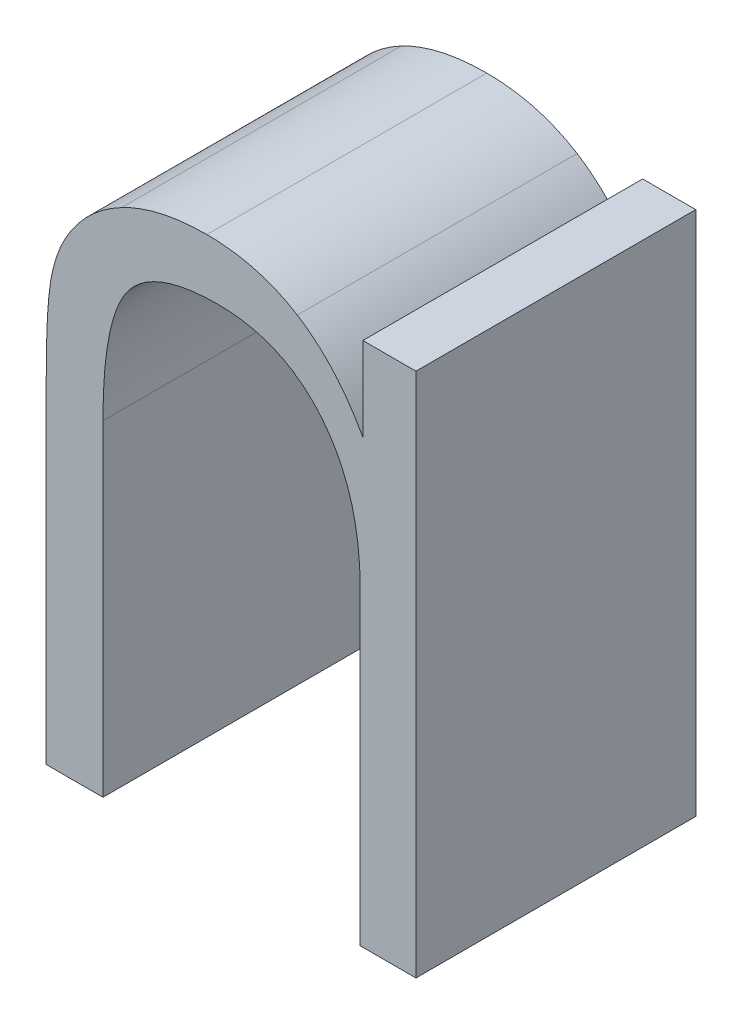
ISO-10303-21;
HEADER;
FILE_DESCRIPTION(('STEP AP214'),'2;1');
FILE_NAME('part.step','',(''),(''),'','','');
FILE_SCHEMA(('AUTOMOTIVE_DESIGN { 1 0 10303 214 1 1 1 1 }'));
ENDSEC;
DATA;
#1=APPLICATION_CONTEXT('core data for automotive mechanical design processes');
#2=APPLICATION_PROTOCOL_DEFINITION('international standard','automotive_design',2000,#1);
#3=PRODUCT_CONTEXT('',#1,'mechanical');
#4=PRODUCT('Part','Part','',(#3));
#5=PRODUCT_RELATED_PRODUCT_CATEGORY('part','',(#4));
#6=PRODUCT_DEFINITION_FORMATION('','',#4);
#7=PRODUCT_DEFINITION_CONTEXT('part definition',#1,'design');
#8=PRODUCT_DEFINITION('design','',#6,#7);
#9=PRODUCT_DEFINITION_SHAPE('','',#8);
#10=(LENGTH_UNIT() NAMED_UNIT(*) SI_UNIT(.MILLI.,.METRE.));
#11=(NAMED_UNIT(*) PLANE_ANGLE_UNIT() SI_UNIT($,.RADIAN.));
#12=(NAMED_UNIT(*) SI_UNIT($,.STERADIAN.) SOLID_ANGLE_UNIT());
#13=UNCERTAINTY_MEASURE_WITH_UNIT(LENGTH_MEASURE(1.E-05),#10,'distance_accuracy_value','');
#14=(GEOMETRIC_REPRESENTATION_CONTEXT(3) GLOBAL_UNCERTAINTY_ASSIGNED_CONTEXT((#13)) GLOBAL_UNIT_ASSIGNED_CONTEXT((#10,
#11,#12)) REPRESENTATION_CONTEXT('',''));
#15=CARTESIAN_POINT('',(0.,0.,0.));
#16=DIRECTION('',(0.,0.,1.));
#17=DIRECTION('',(1.,0.,0.));
#18=AXIS2_PLACEMENT_3D('',#15,#16,#17);
#19=CARTESIAN_POINT('',(-9.736482957406,-5.07579139178174,-5.5));
#20=DIRECTION('',(0.,0.,1.));
#21=DIRECTION('',(0.,-1.,0.));
#22=AXIS2_PLACEMENT_3D('',#19,#20,#21);
#23=PLANE('',#22);
#24=DIRECTION('',(0.,1.,0.));
#25=VECTOR('',#24,1.);
#26=CARTESIAN_POINT('',(-9.105806313635,-6.13847583919,-5.5));
#27=LINE('',#26,#25);
#28=CARTESIAN_POINT('',(-9.105806313635,-6.13847583919,-5.5));
#29=VERTEX_POINT('',#28);
#30=CARTESIAN_POINT('',(-9.105806313635,-4.260241794746,-5.5));
#31=VERTEX_POINT('',#30);
#32=EDGE_CURVE('E228',#29,#31,#27,.T.);
#33=ORIENTED_EDGE('',*,*,#32,.T.);
#34=DIRECTION('',(-1.,0.,0.));
#35=VECTOR('',#34,1.);
#36=CARTESIAN_POINT('',(-9.105806313635,-4.260241794746,-5.5));
#37=LINE('',#36,#35);
#38=CARTESIAN_POINT('',(-9.295623335857,-4.260241794746,-5.5));
#39=VERTEX_POINT('',#38);
#40=EDGE_CURVE('E223',#31,#39,#37,.T.);
#41=ORIENTED_EDGE('',*,*,#40,.T.);
#42=DIRECTION('',(0.,-1.,0.));
#43=VECTOR('',#42,1.);
#44=CARTESIAN_POINT('',(-9.295623335857,-4.260241794746,-5.5));
#45=LINE('',#44,#43);
#46=CARTESIAN_POINT('',(-9.295623335857,-4.559501772523,-5.5));
#47=VERTEX_POINT('',#46);
#48=EDGE_CURVE('E263',#39,#47,#45,.T.);
#49=ORIENTED_EDGE('',*,*,#48,.T.);
#50=CARTESIAN_POINT('',(-9.295623335857,-4.559501772523,-5.5));
#51=CARTESIAN_POINT('',(-9.35898786919,-4.443968461412,-5.5));
#52=CARTESIAN_POINT('',(-9.436929180301,-4.356990394746,-5.5));
#53=CARTESIAN_POINT('',(-9.529856491412,-4.298700216968,-5.5));
#54=(BOUNDED_CURVE() B_SPLINE_CURVE(3,(#50,#51,#52,#53),.UNSPECIFIED.,.F.,
.F.) B_SPLINE_CURVE_WITH_KNOTS((4,4),(0.,1.),
.UNSPECIFIED.) CURVE() GEOMETRIC_REPRESENTATION_ITEM() RATIONAL_B_SPLINE_CURVE((1.,1.,1.,1.)) REPRESENTATION_ITEM(''));
#55=CARTESIAN_POINT('',(-9.529856491412,-4.298700216968,-5.5));
#56=VERTEX_POINT('',#55);
#57=EDGE_CURVE('E291',#47,#56,#54,.T.);
#58=ORIENTED_EDGE('',*,*,#57,.T.);
#59=CARTESIAN_POINT('',(-22.8474219694646,-30.2296003791704,-5.5));
#60=DIRECTION('',(0.,0.,1.));
#61=DIRECTION('',(0.455370570291636,0.890301995792591,0.));
#62=AXIS2_PLACEMENT_3D('',#59,#60,#61);
#63=ELLIPSE('',#62,29.1529102385653,3.99176430542599);
#64=CARTESIAN_POINT('',(-9.852766691412,-4.211132305857,-5.5));
#65=VERTEX_POINT('',#64);
#66=EDGE_CURVE('E244',#56,#65,#63,.T.);
#67=ORIENTED_EDGE('',*,*,#66,.T.);
#68=CARTESIAN_POINT('',(-9.852766691412,-4.211132305857,-5.5));
#69=CARTESIAN_POINT('',(-9.968887024746,-4.211132305857,-5.5));
#70=CARTESIAN_POINT('',(-10.07069586919,-4.234051572523,-5.5));
#71=CARTESIAN_POINT('',(-10.15817346919,-4.280070728079,-5.5));
#72=(BOUNDED_CURVE() B_SPLINE_CURVE(3,(#68,#69,#70,#71),.UNSPECIFIED.,.F.,
.F.) B_SPLINE_CURVE_WITH_KNOTS((4,4),(0.,1.),
.UNSPECIFIED.) CURVE() GEOMETRIC_REPRESENTATION_ITEM() RATIONAL_B_SPLINE_CURVE((1.,1.,1.,1.)) REPRESENTATION_ITEM(''));
#73=CARTESIAN_POINT('',(-10.15817346919,-4.280070728079,-5.5));
#74=VERTEX_POINT('',#73);
#75=EDGE_CURVE('E354',#65,#74,#72,.T.);
#76=ORIENTED_EDGE('',*,*,#75,.T.);
#77=CARTESIAN_POINT('',(104.216214437207,-108.342170691661,-5.5));
#78=DIRECTION('',(0.,0.,1.));
#79=DIRECTION('',(-0.740395912074148,0.672171029860623,0.));
#80=AXIS2_PLACEMENT_3D('',#77,#78,#79);
#81=ELLIPSE('',#80,154.660357930457,8.45990369452761);
#82=CARTESIAN_POINT('',(-10.359135446968,-4.476370394746,-5.5));
#83=VERTEX_POINT('',#82);
#84=EDGE_CURVE('E271',#74,#83,#81,.T.);
#85=ORIENTED_EDGE('',*,*,#84,.T.);
#86=CARTESIAN_POINT('',(-8.24635407089343,-7.5648203471131,-5.5));
#87=DIRECTION('',(0.,0.,1.));
#88=DIRECTION('',(-0.535317252705023,0.844651075270935,0.));
#89=AXIS2_PLACEMENT_3D('',#86,#87,#88);
#90=ELLIPSE('',#89,3.7751112582971,0.96020332293076);
#91=CARTESIAN_POINT('',(-10.411355024746,-4.634499505857,-5.5));
#92=VERTEX_POINT('',#91);
#93=EDGE_CURVE('E382',#83,#92,#90,.T.);
#94=ORIENTED_EDGE('',*,*,#93,.T.);
#95=CARTESIAN_POINT('',(-8.59642921922141,-18.5490954288722,-5.5));
#96=DIRECTION('',(0.,0.,1.));
#97=DIRECTION('',(-0.126455778520576,0.991972245619178,0.));
#98=AXIS2_PLACEMENT_3D('',#95,#96,#97);
#99=ELLIPSE('',#98,14.0994026021358,0.418747631536533);
#100=CARTESIAN_POINT('',(-10.427128424746,-4.93968332807888,-5.5));
#101=VERTEX_POINT('',#100);
#102=EDGE_CURVE('E281',#92,#101,#99,.T.);
#103=ORIENTED_EDGE('',*,*,#102,.T.);
#104=DIRECTION('',(0.,-1.,0.));
#105=VECTOR('',#104,1.);
#106=CARTESIAN_POINT('',(-10.427128424746,-4.99425946141222,-5.5));
#107=LINE('',#106,#105);
#108=CARTESIAN_POINT('',(-10.427128424746,-6.138478661412,-5.5));
#109=VERTEX_POINT('',#108);
#110=EDGE_CURVE('E276',#101,#109,#107,.T.);
#111=ORIENTED_EDGE('',*,*,#110,.T.);
#112=DIRECTION('',(1.,0.,0.));
#113=VECTOR('',#112,1.);
#114=CARTESIAN_POINT('',(-10.427128424746,-6.138478661412,-5.5));
#115=LINE('',#114,#113);
#116=CARTESIAN_POINT('',(-10.224459002523,-6.138478661412,-5.5));
#117=VERTEX_POINT('',#116);
#118=EDGE_CURVE('E205',#109,#117,#115,.T.);
#119=ORIENTED_EDGE('',*,*,#118,.T.);
#120=DIRECTION('',(0.,1.,0.));
#121=VECTOR('',#120,1.);
#122=CARTESIAN_POINT('',(-10.224459002523,-6.138478661412,-5.5));
#123=LINE('',#122,#121);
#124=CARTESIAN_POINT('',(-10.224459002523,-4.9731125503011,-5.5));
#125=VERTEX_POINT('',#124);
#126=EDGE_CURVE('E201',#117,#125,#123,.T.);
#127=ORIENTED_EDGE('',*,*,#126,.T.);
#128=CARTESIAN_POINT('',(-10.224459002523,-4.9731125503011,-5.5));
#129=CARTESIAN_POINT('',(-10.224459002523,-4.752696994746,-5.5));
#130=CARTESIAN_POINT('',(-10.194227358079,-4.603144616968,-5.5));
#131=CARTESIAN_POINT('',(-10.133529824746,-4.52489003919,-5.5));
#132=(BOUNDED_CURVE() B_SPLINE_CURVE(3,(#128,#129,#130,#131),.UNSPECIFIED.,.F.,
.F.) B_SPLINE_CURVE_WITH_KNOTS((4,4),(0.,1.),
.UNSPECIFIED.) CURVE() GEOMETRIC_REPRESENTATION_ITEM() RATIONAL_B_SPLINE_CURVE((1.,1.,1.,1.)) REPRESENTATION_ITEM(''));
#133=CARTESIAN_POINT('',(-10.133529824746,-4.52489003919,-5.5));
#134=VERTEX_POINT('',#133);
#135=EDGE_CURVE('E186',#125,#134,#132,.T.);
#136=ORIENTED_EDGE('',*,*,#135,.T.);
#137=CARTESIAN_POINT('',(21.8561241505114,-31.5914710081315,-5.5));
#138=DIRECTION('',(0.,0.,-1.));
#139=DIRECTION('',(-0.763237745324347,0.646117747869695,0.));
#140=AXIS2_PLACEMENT_3D('',#137,#138,#139);
#141=ELLIPSE('',#140,41.9041521371283,3.18884140606767);
#142=CARTESIAN_POINT('',(-9.813794624746,-4.407282394746,-5.5));
#143=VERTEX_POINT('',#142);
#144=EDGE_CURVE('E252',#134,#143,#141,.T.);
#145=ORIENTED_EDGE('',*,*,#144,.T.);
#146=CARTESIAN_POINT('',(-9.813794624746,-4.407282394746,-5.5));
#147=CARTESIAN_POINT('',(-9.656839558079,-4.407282394746,-5.5));
#148=CARTESIAN_POINT('',(-9.532912958079,-4.463055150301,-5.5));
#149=CARTESIAN_POINT('',(-9.441845491412,-4.574589372523,-5.5));
#150=(BOUNDED_CURVE() B_SPLINE_CURVE(3,(#146,#147,#148,#149),.UNSPECIFIED.,.F.,
.F.) B_SPLINE_CURVE_WITH_KNOTS((4,4),(0.,1.),
.UNSPECIFIED.) CURVE() GEOMETRIC_REPRESENTATION_ITEM() RATIONAL_B_SPLINE_CURVE((1.,1.,1.,1.)) REPRESENTATION_ITEM(''));
#151=CARTESIAN_POINT('',(-9.441845491412,-4.574589372523,-5.5));
#152=VERTEX_POINT('',#151);
#153=EDGE_CURVE('E297',#143,#152,#150,.T.);
#154=ORIENTED_EDGE('',*,*,#153,.T.);
#155=CARTESIAN_POINT('',(-50.0071450962571,-40.8087372639928,-5.5));
#156=DIRECTION('',(0.,0.,-1.));
#157=DIRECTION('',(-0.745524423428975,-0.666478307277059,0.));
#158=AXIS2_PLACEMENT_3D('',#155,#156,#157);
#159=ELLIPSE('',#158,54.3921909669743,5.25787854108628);
#160=CARTESIAN_POINT('',(-9.305306380301,-5.02961343918999,-5.5));
#161=VERTEX_POINT('',#160);
#162=EDGE_CURVE('E280',#152,#161,#159,.T.);
#163=ORIENTED_EDGE('',*,*,#162,.T.);
#164=DIRECTION('',(0.,-1.,0.));
#165=VECTOR('',#164,1.);
#166=CARTESIAN_POINT('',(-9.305306380301,-5.02961343918999,-5.5));
#167=LINE('',#166,#165);
#168=CARTESIAN_POINT('',(-9.305306380301,-6.13847583919,-5.5));
#169=VERTEX_POINT('',#168);
#170=EDGE_CURVE('E65',#161,#169,#167,.T.);
#171=ORIENTED_EDGE('',*,*,#170,.T.);
#172=DIRECTION('',(1.,0.,0.));
#173=VECTOR('',#172,1.);
#174=CARTESIAN_POINT('',(-9.305306380301,-6.13847583919,-5.5));
#175=LINE('',#174,#173);
#176=EDGE_CURVE('E11',#169,#29,#175,.T.);
#177=ORIENTED_EDGE('',*,*,#176,.T.);
#178=EDGE_LOOP('',(#33,#41,#49,#58,#67,#76,#85,#94,#103,#111,#119,#127,#136,#145,#154,#163,#171,#177));
#179=FACE_BOUND('',#178,.T.);
#180=ADVANCED_FACE('F16',(#179),#23,.T.);
#181=CARTESIAN_POINT('',(-9.736482957406,-5.07579139178174,-6.5));
#182=DIRECTION('',(0.,0.,1.));
#183=DIRECTION('',(0.,-1.,0.));
#184=AXIS2_PLACEMENT_3D('',#181,#182,#183);
#185=PLANE('',#184);
#186=DIRECTION('',(0.,1.,0.));
#187=VECTOR('',#186,1.);
#188=CARTESIAN_POINT('',(-9.105806313635,-6.13847583919,-6.5));
#189=LINE('',#188,#187);
#190=CARTESIAN_POINT('',(-9.105806313635,-6.13847583919,-6.5));
#191=VERTEX_POINT('',#190);
#192=CARTESIAN_POINT('',(-9.105806313635,-4.260241794746,-6.5));
#193=VERTEX_POINT('',#192);
#194=EDGE_CURVE('E229',#191,#193,#189,.T.);
#195=ORIENTED_EDGE('',*,*,#194,.F.);
#196=DIRECTION('',(1.,0.,0.));
#197=VECTOR('',#196,1.);
#198=CARTESIAN_POINT('',(-9.305306380301,-6.13847583919,-6.5));
#199=LINE('',#198,#197);
#200=CARTESIAN_POINT('',(-9.305306380301,-6.13847583919,-6.5));
#201=VERTEX_POINT('',#200);
#202=EDGE_CURVE('E27',#201,#191,#199,.T.);
#203=ORIENTED_EDGE('',*,*,#202,.F.);
#204=DIRECTION('',(0.,-1.,0.));
#205=VECTOR('',#204,1.);
#206=CARTESIAN_POINT('',(-9.305306380301,-5.02961343918999,-6.5));
#207=LINE('',#206,#205);
#208=CARTESIAN_POINT('',(-9.305306380301,-5.02961343918999,-6.5));
#209=VERTEX_POINT('',#208);
#210=EDGE_CURVE('E77',#209,#201,#207,.T.);
#211=ORIENTED_EDGE('',*,*,#210,.F.);
#212=CARTESIAN_POINT('',(-50.0071450962571,-40.8087372639928,-6.5));
#213=DIRECTION('',(0.,0.,-1.));
#214=DIRECTION('',(-0.745524423428975,-0.666478307277059,0.));
#215=AXIS2_PLACEMENT_3D('',#212,#213,#214);
#216=ELLIPSE('',#215,54.3921909669743,5.25787854108628);
#217=CARTESIAN_POINT('',(-9.441845491412,-4.574589372523,-6.5));
#218=VERTEX_POINT('',#217);
#219=EDGE_CURVE('E292',#218,#209,#216,.T.);
#220=ORIENTED_EDGE('',*,*,#219,.F.);
#221=CARTESIAN_POINT('',(-9.813794624746,-4.407282394746,-6.5));
#222=CARTESIAN_POINT('',(-9.656839558079,-4.407282394746,-6.5));
#223=CARTESIAN_POINT('',(-9.532912958079,-4.463055150301,-6.5));
#224=CARTESIAN_POINT('',(-9.441845491412,-4.574589372523,-6.5));
#225=(BOUNDED_CURVE() B_SPLINE_CURVE(3,(#221,#222,#223,#224),.UNSPECIFIED.,.F.,
.F.) B_SPLINE_CURVE_WITH_KNOTS((4,4),(0.,1.),
.UNSPECIFIED.) CURVE() GEOMETRIC_REPRESENTATION_ITEM() RATIONAL_B_SPLINE_CURVE((1.,1.,1.,1.)) REPRESENTATION_ITEM(''));
#226=CARTESIAN_POINT('',(-9.813794624746,-4.407282394746,-6.5));
#227=VERTEX_POINT('',#226);
#228=EDGE_CURVE('E255',#227,#218,#225,.T.);
#229=ORIENTED_EDGE('',*,*,#228,.F.);
#230=CARTESIAN_POINT('',(21.8561241505114,-31.5914710081315,-6.5));
#231=DIRECTION('',(0.,0.,-1.));
#232=DIRECTION('',(-0.763237745324347,0.646117747869695,0.));
#233=AXIS2_PLACEMENT_3D('',#230,#231,#232);
#234=ELLIPSE('',#233,41.9041521371283,3.18884140606767);
#235=CARTESIAN_POINT('',(-10.133529824746,-4.52489003919,-6.5));
#236=VERTEX_POINT('',#235);
#237=EDGE_CURVE('E198',#236,#227,#234,.T.);
#238=ORIENTED_EDGE('',*,*,#237,.F.);
#239=CARTESIAN_POINT('',(-10.224459002523,-4.9731125503011,-6.5));
#240=CARTESIAN_POINT('',(-10.224459002523,-4.752696994746,-6.5));
#241=CARTESIAN_POINT('',(-10.194227358079,-4.603144616968,-6.5));
#242=CARTESIAN_POINT('',(-10.133529824746,-4.52489003919,-6.5));
#243=(BOUNDED_CURVE() B_SPLINE_CURVE(3,(#239,#240,#241,#242),.UNSPECIFIED.,.F.,
.F.) B_SPLINE_CURVE_WITH_KNOTS((4,4),(0.,1.),
.UNSPECIFIED.) CURVE() GEOMETRIC_REPRESENTATION_ITEM() RATIONAL_B_SPLINE_CURVE((1.,1.,1.,1.)) REPRESENTATION_ITEM(''));
#244=CARTESIAN_POINT('',(-10.224459002523,-4.9731125503011,-6.5));
#245=VERTEX_POINT('',#244);
#246=EDGE_CURVE('E210',#245,#236,#243,.T.);
#247=ORIENTED_EDGE('',*,*,#246,.F.);
#248=DIRECTION('',(0.,1.,0.));
#249=VECTOR('',#248,1.);
#250=CARTESIAN_POINT('',(-10.224459002523,-6.138478661412,-6.5));
#251=LINE('',#250,#249);
#252=CARTESIAN_POINT('',(-10.224459002523,-6.138478661412,-6.5));
#253=VERTEX_POINT('',#252);
#254=EDGE_CURVE('E213',#253,#245,#251,.T.);
#255=ORIENTED_EDGE('',*,*,#254,.F.);
#256=DIRECTION('',(1.,0.,0.));
#257=VECTOR('',#256,1.);
#258=CARTESIAN_POINT('',(-10.427128424746,-6.138478661412,-6.5));
#259=LINE('',#258,#257);
#260=CARTESIAN_POINT('',(-10.427128424746,-6.138478661412,-6.5));
#261=VERTEX_POINT('',#260);
#262=EDGE_CURVE('E233',#261,#253,#259,.T.);
#263=ORIENTED_EDGE('',*,*,#262,.F.);
#264=DIRECTION('',(0.,-1.,0.));
#265=VECTOR('',#264,1.);
#266=CARTESIAN_POINT('',(-10.427128424746,-4.93968332807888,-6.5));
#267=LINE('',#266,#265);
#268=CARTESIAN_POINT('',(-10.427128424746,-4.93968332807888,-6.5));
#269=VERTEX_POINT('',#268);
#270=EDGE_CURVE('E277',#269,#261,#267,.T.);
#271=ORIENTED_EDGE('',*,*,#270,.F.);
#272=CARTESIAN_POINT('',(-8.59642921922141,-18.5490954288722,-6.5));
#273=DIRECTION('',(0.,0.,1.));
#274=DIRECTION('',(-0.126455778520576,0.991972245619178,0.));
#275=AXIS2_PLACEMENT_3D('',#272,#273,#274);
#276=ELLIPSE('',#275,14.0994026021358,0.418747631536533);
#277=CARTESIAN_POINT('',(-10.411355024746,-4.634499505857,-6.5));
#278=VERTEX_POINT('',#277);
#279=EDGE_CURVE('E345',#278,#269,#276,.T.);
#280=ORIENTED_EDGE('',*,*,#279,.F.);
#281=CARTESIAN_POINT('',(-8.24635407089343,-7.5648203471131,-6.5));
#282=DIRECTION('',(0.,0.,1.));
#283=DIRECTION('',(-0.535317252705023,0.844651075270935,0.));
#284=AXIS2_PLACEMENT_3D('',#281,#282,#283);
#285=ELLIPSE('',#284,3.7751112582971,0.96020332293076);
#286=CARTESIAN_POINT('',(-10.359135446968,-4.476370394746,-6.5));
#287=VERTEX_POINT('',#286);
#288=EDGE_CURVE('E399',#287,#278,#285,.T.);
#289=ORIENTED_EDGE('',*,*,#288,.F.);
#290=CARTESIAN_POINT('',(104.216214437207,-108.342170691661,-6.5));
#291=DIRECTION('',(0.,0.,1.));
#292=DIRECTION('',(-0.740395912074148,0.672171029860623,0.));
#293=AXIS2_PLACEMENT_3D('',#290,#291,#292);
#294=ELLIPSE('',#293,154.660357930457,8.45990369452761);
#295=CARTESIAN_POINT('',(-10.15817346919,-4.280070728079,-6.5));
#296=VERTEX_POINT('',#295);
#297=EDGE_CURVE('E20',#296,#287,#294,.T.);
#298=ORIENTED_EDGE('',*,*,#297,.F.);
#299=CARTESIAN_POINT('',(-9.852766691412,-4.211132305857,-6.5));
#300=CARTESIAN_POINT('',(-9.968887024746,-4.211132305857,-6.5));
#301=CARTESIAN_POINT('',(-10.07069586919,-4.234051572523,-6.5));
#302=CARTESIAN_POINT('',(-10.15817346919,-4.280070728079,-6.5));
#303=(BOUNDED_CURVE() B_SPLINE_CURVE(3,(#299,#300,#301,#302),.UNSPECIFIED.,.F.,
.F.) B_SPLINE_CURVE_WITH_KNOTS((4,4),(0.,1.),
.UNSPECIFIED.) CURVE() GEOMETRIC_REPRESENTATION_ITEM() RATIONAL_B_SPLINE_CURVE((1.,1.,1.,1.)) REPRESENTATION_ITEM(''));
#304=CARTESIAN_POINT('',(-9.852766691412,-4.211132305857,-6.5));
#305=VERTEX_POINT('',#304);
#306=EDGE_CURVE('E237',#305,#296,#303,.T.);
#307=ORIENTED_EDGE('',*,*,#306,.F.);
#308=CARTESIAN_POINT('',(-22.8474219694646,-30.2296003791704,-6.5));
#309=DIRECTION('',(0.,0.,1.));
#310=DIRECTION('',(0.455370570291636,0.890301995792591,0.));
#311=AXIS2_PLACEMENT_3D('',#308,#309,#310);
#312=ELLIPSE('',#311,29.1529102385653,3.99176430542599);
#313=CARTESIAN_POINT('',(-9.529856491412,-4.298700216968,-6.5));
#314=VERTEX_POINT('',#313);
#315=EDGE_CURVE('E286',#314,#305,#312,.T.);
#316=ORIENTED_EDGE('',*,*,#315,.F.);
#317=CARTESIAN_POINT('',(-9.295623335857,-4.559501772523,-6.5));
#318=CARTESIAN_POINT('',(-9.35898786919,-4.443968461412,-6.5));
#319=CARTESIAN_POINT('',(-9.436929180301,-4.356990394746,-6.5));
#320=CARTESIAN_POINT('',(-9.529856491412,-4.298700216968,-6.5));
#321=(BOUNDED_CURVE() B_SPLINE_CURVE(3,(#317,#318,#319,#320),.UNSPECIFIED.,.F.,
.F.) B_SPLINE_CURVE_WITH_KNOTS((4,4),(0.,1.),
.UNSPECIFIED.) CURVE() GEOMETRIC_REPRESENTATION_ITEM() RATIONAL_B_SPLINE_CURVE((1.,1.,1.,1.)) REPRESENTATION_ITEM(''));
#322=CARTESIAN_POINT('',(-9.295623335857,-4.559501772523,-6.5));
#323=VERTEX_POINT('',#322);
#324=EDGE_CURVE('E256',#323,#314,#321,.T.);
#325=ORIENTED_EDGE('',*,*,#324,.F.);
#326=DIRECTION('',(0.,-1.,0.));
#327=VECTOR('',#326,1.);
#328=CARTESIAN_POINT('',(-9.295623335857,-4.260241794746,-6.5));
#329=LINE('',#328,#327);
#330=CARTESIAN_POINT('',(-9.295623335857,-4.260241794746,-6.5));
#331=VERTEX_POINT('',#330);
#332=EDGE_CURVE('E372',#331,#323,#329,.T.);
#333=ORIENTED_EDGE('',*,*,#332,.F.);
#334=DIRECTION('',(-1.,0.,0.));
#335=VECTOR('',#334,1.);
#336=CARTESIAN_POINT('',(-9.105806313635,-4.260241794746,-6.5));
#337=LINE('',#336,#335);
#338=EDGE_CURVE('E317',#193,#331,#337,.T.);
#339=ORIENTED_EDGE('',*,*,#338,.F.);
#340=EDGE_LOOP('',(#195,#203,#211,#220,#229,#238,#247,#255,#263,#271,#280,#289,#298,#307,#316,
#325,#333,#339));
#341=FACE_BOUND('',#340,.T.);
#342=ADVANCED_FACE('F430',(#341),#185,.F.);
#343=CARTESIAN_POINT('',(-9.205556346968,-6.13847583919,-5.49));
#344=DIRECTION('',(0.,1.,0.));
#345=DIRECTION('',(-1.,0.,0.));
#346=AXIS2_PLACEMENT_3D('',#343,#344,#345);
#347=PLANE('',#346);
#348=DIRECTION('',(0.,0.,1.));
#349=VECTOR('',#348,1.);
#350=CARTESIAN_POINT('',(-9.305306380301,-6.13847583919,-6.5));
#351=LINE('',#350,#349);
#352=EDGE_CURVE('E234',#201,#169,#351,.T.);
#353=ORIENTED_EDGE('',*,*,#352,.F.);
#354=ORIENTED_EDGE('',*,*,#202,.T.);
#355=DIRECTION('',(0.,0.,1.));
#356=VECTOR('',#355,1.);
#357=CARTESIAN_POINT('',(-9.105806313635,-6.13847583919,-6.5));
#358=LINE('',#357,#356);
#359=EDGE_CURVE('E383',#191,#29,#358,.T.);
#360=ORIENTED_EDGE('',*,*,#359,.T.);
#361=ORIENTED_EDGE('',*,*,#176,.F.);
#362=EDGE_LOOP('',(#353,#354,#360,#361));
#363=FACE_BOUND('',#362,.T.);
#364=ADVANCED_FACE('F471',(#363),#347,.F.);
#365=CARTESIAN_POINT('',(-9.305306380301,-5.58404463919,-5.49));
#366=DIRECTION('',(1.,0.,0.));
#367=DIRECTION('',(0.,0.,-1.));
#368=AXIS2_PLACEMENT_3D('',#365,#366,#367);
#369=PLANE('',#368);
#370=DIRECTION('',(0.,0.,1.));
#371=VECTOR('',#370,1.);
#372=CARTESIAN_POINT('',(-9.305306380301,-5.02961343918999,-6.5));
#373=LINE('',#372,#371);
#374=EDGE_CURVE('E296',#209,#161,#373,.T.);
#375=ORIENTED_EDGE('',*,*,#374,.F.);
#376=ORIENTED_EDGE('',*,*,#210,.T.);
#377=ORIENTED_EDGE('',*,*,#352,.T.);
#378=ORIENTED_EDGE('',*,*,#170,.F.);
#379=EDGE_LOOP('',(#375,#376,#377,#378));
#380=FACE_BOUND('',#379,.T.);
#381=ADVANCED_FACE('F18',(#380),#369,.F.);
#382=CARTESIAN_POINT('',(-9.44247912955756,-4.57381584838738,-6.5));
#383=CARTESIAN_POINT('',(-9.3050683631608,-4.74122700588201,-6.50000000000001));
#384=CARTESIAN_POINT('',(-9.30530679260114,-5.03061382750187,-6.5));
#385=CARTESIAN_POINT('',(-9.44247912955756,-4.57381584838738,-5.50000000000001));
#386=CARTESIAN_POINT('',(-9.3050683631608,-4.74122700588201,-5.50000000000001));
#387=CARTESIAN_POINT('',(-9.30530679260114,-5.03061382750187,-5.5));
#388=(BOUNDED_SURFACE() B_SPLINE_SURFACE(1,2,((#382,#383,#384),(#385,#386,#387)),.UNSPECIFIED.,
.F.,.F.,.F.) B_SPLINE_SURFACE_WITH_KNOTS((2,2),(3,3),(-0.0184277876614781,
-4.26498703733728E-05),(0.246270008220274,5.12795475434969),
.UNSPECIFIED.) GEOMETRIC_REPRESENTATION_ITEM() RATIONAL_B_SPLINE_SURFACE(((0.998316379445966,
0.981677841225668,0.96695167685384),(0.998316379445966,0.981677841225668,0.96695167685384))) REPRESENTATION_ITEM('') SURFACE());
#389=DIRECTION('',(0.,0.,1.));
#390=VECTOR('',#389,1.);
#391=CARTESIAN_POINT('',(-9.441845491412,-4.574589372523,-6.5));
#392=LINE('',#391,#390);
#393=EDGE_CURVE('E303',#218,#152,#392,.T.);
#394=ORIENTED_EDGE('',*,*,#393,.F.);
#395=ORIENTED_EDGE('',*,*,#219,.T.);
#396=ORIENTED_EDGE('',*,*,#374,.T.);
#397=ORIENTED_EDGE('',*,*,#162,.F.);
#398=EDGE_LOOP('',(#394,#395,#396,#397));
#399=FACE_BOUND('',#398,.T.);
#400=ADVANCED_FACE('F474',(#399),#388,.F.);
#401=CARTESIAN_POINT('',(-9.813794624746,-4.407282394746,-5.49754786472008));
#402=CARTESIAN_POINT('',(-9.813794624746,-4.407282394746,-6.50245213527992));
#403=CARTESIAN_POINT('',(-9.656839558079,-4.407282394746,-5.49754786472008));
#404=CARTESIAN_POINT('',(-9.656839558079,-4.407282394746,-6.50245213527992));
#405=CARTESIAN_POINT('',(-9.532912958079,-4.463055150301,-5.49754786472008));
#406=CARTESIAN_POINT('',(-9.532912958079,-4.463055150301,-6.50245213527992));
#407=CARTESIAN_POINT('',(-9.441845491412,-4.574589372523,-5.49754786472008));
#408=CARTESIAN_POINT('',(-9.441845491412,-4.574589372523,-6.50245213527992));
#409=(BOUNDED_SURFACE() B_SPLINE_SURFACE(3,1,((#401,#402),(#403,#404),(#405,#406),(#407,#408)),
.UNSPECIFIED.,.F.,.F.,.F.) B_SPLINE_SURFACE_WITH_KNOTS((4,4),(2,2),(0.,1.),(-1.00245213527992,
0.0024521352799199),
.UNSPECIFIED.) GEOMETRIC_REPRESENTATION_ITEM() RATIONAL_B_SPLINE_SURFACE(((1.,1.),(1.,1.),(1.,
1.),(1.,1.))) REPRESENTATION_ITEM('') SURFACE());
#410=DIRECTION('',(0.,0.,1.));
#411=VECTOR('',#410,1.);
#412=CARTESIAN_POINT('',(-9.813794624746,-4.407282394746,-6.5));
#413=LINE('',#412,#411);
#414=EDGE_CURVE('E251',#227,#143,#413,.T.);
#415=ORIENTED_EDGE('',*,*,#414,.F.);
#416=ORIENTED_EDGE('',*,*,#228,.T.);
#417=ORIENTED_EDGE('',*,*,#393,.T.);
#418=ORIENTED_EDGE('',*,*,#153,.F.);
#419=EDGE_LOOP('',(#415,#416,#417,#418));
#420=FACE_BOUND('',#419,.T.);
#421=ADVANCED_FACE('F478',(#420),#409,.F.);
#422=CARTESIAN_POINT('',(-10.1341396852791,-4.52568274726319,-6.5));
#423=CARTESIAN_POINT('',(-10.1305334061174,-4.52097526424396,-6.50000000000001));
#424=CARTESIAN_POINT('',(-10.126706416908,-4.51645456952886,-6.5));
#425=CARTESIAN_POINT('',(-10.0340767742295,-4.40703426202118,-6.50000000000001));
#426=CARTESIAN_POINT('',(-9.8127939324776,-4.40728295757853,-6.5));
#427=CARTESIAN_POINT('',(-10.1341396852791,-4.52568274726319,-5.50000000000001));
#428=CARTESIAN_POINT('',(-10.1305334061174,-4.52097526424396,-5.50000000000001));
#429=CARTESIAN_POINT('',(-10.126706416908,-4.51645456952886,-5.5));
#430=CARTESIAN_POINT('',(-10.0340767742295,-4.40703426202118,-5.50000000000001));
#431=CARTESIAN_POINT('',(-9.8127939324776,-4.40728295757853,-5.5));
#432=(BOUNDED_SURFACE() B_SPLINE_SURFACE(1,2,((#422,#423,#424,#425,#426),(#427,#428,#429,#430,
#431)),.UNSPECIFIED.,.F.,.F.,.F.) B_SPLINE_SURFACE_WITH_KNOTS((2,2),(3,2,3),(-0.023944394682662,
-8.04393339465213E-05),(131.473161536444,131.645932440068,135.754441570926),
.UNSPECIFIED.) GEOMETRIC_REPRESENTATION_ITEM() RATIONAL_B_SPLINE_SURFACE(((0.998466474361706,
0.999231219299497,1.,0.981718319107059,0.965718834146311),(0.998466474361706,0.999231219299497,
1.,0.981718319107059,0.965718834146311))) REPRESENTATION_ITEM('') SURFACE());
#433=DIRECTION('',(0.,0.,1.));
#434=VECTOR('',#433,1.);
#435=CARTESIAN_POINT('',(-10.133529824746,-4.52489003919,-6.5));
#436=LINE('',#435,#434);
#437=EDGE_CURVE('E194',#236,#134,#436,.T.);
#438=ORIENTED_EDGE('',*,*,#437,.F.);
#439=ORIENTED_EDGE('',*,*,#237,.T.);
#440=ORIENTED_EDGE('',*,*,#414,.T.);
#441=ORIENTED_EDGE('',*,*,#144,.F.);
#442=EDGE_LOOP('',(#438,#439,#440,#441));
#443=FACE_BOUND('',#442,.T.);
#444=ADVANCED_FACE('F482',(#443),#432,.F.);
#445=CARTESIAN_POINT('',(-10.224459002523,-4.9731125503011,-5.49663419313379));
#446=CARTESIAN_POINT('',(-10.224459002523,-4.9731125503011,-6.50336580686621));
#447=CARTESIAN_POINT('',(-10.224459002523,-4.752696994746,-5.49663419313379));
#448=CARTESIAN_POINT('',(-10.224459002523,-4.752696994746,-6.50336580686621));
#449=CARTESIAN_POINT('',(-10.194227358079,-4.603144616968,-5.49663419313379));
#450=CARTESIAN_POINT('',(-10.194227358079,-4.603144616968,-6.50336580686621));
#451=CARTESIAN_POINT('',(-10.133529824746,-4.52489003919,-5.49663419313379));
#452=CARTESIAN_POINT('',(-10.133529824746,-4.52489003919,-6.50336580686621));
#453=(BOUNDED_SURFACE() B_SPLINE_SURFACE(3,1,((#445,#446),(#447,#448),(#449,#450),(#451,#452)),
.UNSPECIFIED.,.F.,.F.,.F.) B_SPLINE_SURFACE_WITH_KNOTS((4,4),(2,2),(0.,1.),(-1.00336580686621,
0.00336580686621409),
.UNSPECIFIED.) GEOMETRIC_REPRESENTATION_ITEM() RATIONAL_B_SPLINE_SURFACE(((1.,1.),(1.,1.),(1.,
1.),(1.,1.))) REPRESENTATION_ITEM('') SURFACE());
#454=DIRECTION('',(0.,0.,1.));
#455=VECTOR('',#454,1.);
#456=CARTESIAN_POINT('',(-10.224459002523,-4.9731125503011,-6.5));
#457=LINE('',#456,#455);
#458=EDGE_CURVE('E191',#245,#125,#457,.T.);
#459=ORIENTED_EDGE('',*,*,#458,.F.);
#460=ORIENTED_EDGE('',*,*,#246,.T.);
#461=ORIENTED_EDGE('',*,*,#437,.T.);
#462=ORIENTED_EDGE('',*,*,#135,.F.);
#463=EDGE_LOOP('',(#459,#460,#461,#462));
#464=FACE_BOUND('',#463,.T.);
#465=ADVANCED_FACE('F188',(#464),#453,.F.);
#466=CARTESIAN_POINT('',(-10.224459002523,-5.55579560585655,-5.49));
#467=DIRECTION('',(-1.,0.,0.));
#468=DIRECTION('',(0.,1.,0.));
#469=AXIS2_PLACEMENT_3D('',#466,#467,#468);
#470=PLANE('',#469);
#471=DIRECTION('',(0.,0.,1.));
#472=VECTOR('',#471,1.);
#473=CARTESIAN_POINT('',(-10.224459002523,-6.138478661412,-6.5));
#474=LINE('',#473,#472);
#475=EDGE_CURVE('E230',#253,#117,#474,.T.);
#476=ORIENTED_EDGE('',*,*,#475,.F.);
#477=ORIENTED_EDGE('',*,*,#254,.T.);
#478=ORIENTED_EDGE('',*,*,#458,.T.);
#479=ORIENTED_EDGE('',*,*,#126,.F.);
#480=EDGE_LOOP('',(#476,#477,#478,#479));
#481=FACE_BOUND('',#480,.T.);
#482=ADVANCED_FACE('F212',(#481),#470,.F.);
#483=CARTESIAN_POINT('',(-10.3257937136345,-6.138478661412,-5.49));
#484=DIRECTION('',(0.,1.,0.));
#485=DIRECTION('',(-1.,0.,0.));
#486=AXIS2_PLACEMENT_3D('',#483,#484,#485);
#487=PLANE('',#486);
#488=DIRECTION('',(0.,0.,1.));
#489=VECTOR('',#488,1.);
#490=CARTESIAN_POINT('',(-10.427128424746,-6.138478661412,-6.5));
#491=LINE('',#490,#489);
#492=EDGE_CURVE('E272',#261,#109,#491,.T.);
#493=ORIENTED_EDGE('',*,*,#492,.F.);
#494=ORIENTED_EDGE('',*,*,#262,.T.);
#495=ORIENTED_EDGE('',*,*,#475,.T.);
#496=ORIENTED_EDGE('',*,*,#118,.F.);
#497=EDGE_LOOP('',(#493,#494,#495,#496));
#498=FACE_BOUND('',#497,.T.);
#499=ADVANCED_FACE('F436',(#498),#487,.F.);
#500=CARTESIAN_POINT('',(-10.427128424746,-4.96697139474555,-5.49));
#501=DIRECTION('',(1.,0.,0.));
#502=DIRECTION('',(0.,0.,-1.));
#503=AXIS2_PLACEMENT_3D('',#500,#501,#502);
#504=PLANE('',#503);
#505=DIRECTION('',(0.,0.,1.));
#506=VECTOR('',#505,1.);
#507=CARTESIAN_POINT('',(-10.427128424746,-4.93968332807888,-6.5));
#508=LINE('',#507,#506);
#509=EDGE_CURVE('E285',#269,#101,#508,.T.);
#510=ORIENTED_EDGE('',*,*,#509,.F.);
#511=ORIENTED_EDGE('',*,*,#270,.T.);
#512=ORIENTED_EDGE('',*,*,#492,.T.);
#513=ORIENTED_EDGE('',*,*,#110,.F.);
#514=EDGE_LOOP('',(#510,#511,#512,#513));
#515=FACE_BOUND('',#514,.T.);
#516=ADVANCED_FACE('F425',(#515),#504,.F.);
#517=CARTESIAN_POINT('',(-10.411187470515,-4.63351707372742,-6.5));
#518=CARTESIAN_POINT('',(-10.4271659902308,-4.72663787112881,-6.5));
#519=CARTESIAN_POINT('',(-10.4271283366062,-4.94068402664169,-6.5));
#520=CARTESIAN_POINT('',(-10.411187470515,-4.63351707372742,-5.5));
#521=CARTESIAN_POINT('',(-10.4271659902308,-4.72663787112881,-5.5));
#522=CARTESIAN_POINT('',(-10.4271283366062,-4.94068402664169,-5.50000000000001));
#523=(BOUNDED_SURFACE() B_SPLINE_SURFACE(1,2,((#517,#518,#519),(#520,#521,#522)),.UNSPECIFIED.,
.F.,.F.,.F.) B_SPLINE_SURFACE_WITH_KNOTS((2,2),(3,3),(-0.0713024630755486,
-0.000376977265768436),(45.782019514763,47.7354338820826),
.UNSPECIFIED.) GEOMETRIC_REPRESENTATION_ITEM() RATIONAL_B_SPLINE_SURFACE(((0.963292797809708,
0.94092991535619,0.923124179002828),(0.963292797809708,0.94092991535619,0.923124179002828))) REPRESENTATION_ITEM('') SURFACE());
#524=DIRECTION('',(0.,0.,1.));
#525=VECTOR('',#524,1.);
#526=CARTESIAN_POINT('',(-10.411355024746,-4.634499505857,-6.5));
#527=LINE('',#526,#525);
#528=EDGE_CURVE('E389',#278,#92,#527,.T.);
#529=ORIENTED_EDGE('',*,*,#528,.F.);
#530=ORIENTED_EDGE('',*,*,#279,.T.);
#531=ORIENTED_EDGE('',*,*,#509,.T.);
#532=ORIENTED_EDGE('',*,*,#102,.F.);
#533=EDGE_LOOP('',(#529,#530,#531,#532));
#534=FACE_BOUND('',#533,.T.);
#535=ADVANCED_FACE('F441',(#534),#523,.F.);
#536=CARTESIAN_POINT('',(-10.3586474849438,-4.47549852258192,-6.5));
#537=CARTESIAN_POINT('',(-10.3954406552287,-4.54101869146679,-6.50000000000001));
#538=CARTESIAN_POINT('',(-10.4115503479503,-4.63564124653356,-6.50000000000001));
#539=CARTESIAN_POINT('',(-10.3586474849438,-4.47549852258192,-5.49999999999999));
#540=CARTESIAN_POINT('',(-10.3954406552287,-4.54101869146679,-5.5));
#541=CARTESIAN_POINT('',(-10.4115503479503,-4.63564124653356,-5.50000000000001));
#542=(BOUNDED_SURFACE() B_SPLINE_SURFACE(1,2,((#536,#537,#538),(#539,#540,#541)),.UNSPECIFIED.,
.F.,.F.,.F.) B_SPLINE_SURFACE_WITH_KNOTS((2,2),(3,3),(-0.266698156131128,-0.00177342405579423),
(12.4147116460111,12.9561224685811),
.UNSPECIFIED.) GEOMETRIC_REPRESENTATION_ITEM() RATIONAL_B_SPLINE_SURFACE(((0.950197905651921,
0.928471503124334,0.911629356744179),(0.950197905651921,0.928471503124334,0.911629356744179))) REPRESENTATION_ITEM('') SURFACE());
#543=DIRECTION('',(0.,0.,1.));
#544=VECTOR('',#543,1.);
#545=CARTESIAN_POINT('',(-10.359135446968,-4.476370394746,-6.5));
#546=LINE('',#545,#544);
#547=EDGE_CURVE('E264',#287,#83,#546,.T.);
#548=ORIENTED_EDGE('',*,*,#547,.F.);
#549=ORIENTED_EDGE('',*,*,#288,.T.);
#550=ORIENTED_EDGE('',*,*,#528,.T.);
#551=ORIENTED_EDGE('',*,*,#93,.F.);
#552=EDGE_LOOP('',(#548,#549,#550,#551));
#553=FACE_BOUND('',#552,.T.);
#554=ADVANCED_FACE('F444',(#553),#542,.F.);
#555=CARTESIAN_POINT('',(-10.157227096289,-4.27957275086115,-6.5));
#556=CARTESIAN_POINT('',(-10.2368755353611,-4.32138594501791,-6.5));
#557=CARTESIAN_POINT('',(-10.2936824084305,-4.38395870400214,-6.5));
#558=CARTESIAN_POINT('',(-10.3318026432395,-4.42594813479185,-6.5));
#559=CARTESIAN_POINT('',(-10.3596280502109,-4.4772768734019,-6.5));
#560=CARTESIAN_POINT('',(-10.157227096289,-4.27957275086115,-5.5));
#561=CARTESIAN_POINT('',(-10.2368755353611,-4.32138594501791,-5.5));
#562=CARTESIAN_POINT('',(-10.2936824084305,-4.38395870400214,-5.5));
#563=CARTESIAN_POINT('',(-10.3318026432395,-4.42594813479185,-5.50000000000001));
#564=CARTESIAN_POINT('',(-10.3596280502109,-4.4772768734019,-5.50000000000001));
#565=(BOUNDED_SURFACE() B_SPLINE_SURFACE(1,2,((#555,#556,#557,#558,#559),(#560,#561,#562,#563,
#564)),.UNSPECIFIED.,.F.,.F.,.F.) B_SPLINE_SURFACE_WITH_KNOTS((2,2),(3,2,3),
(-0.00648830856144806,-2.30122723462135E-05),(482.498107251208,485.916269434609,
488.213139539764),
.UNSPECIFIED.) GEOMETRIC_REPRESENTATION_ITEM() RATIONAL_B_SPLINE_SURFACE(((0.991874556334613,
0.995879304368682,1.,0.997231055140104,0.994514464210888),(0.991874556334613,0.995879304368682,
1.,0.997231055140104,0.994514464210888))) REPRESENTATION_ITEM('') SURFACE());
#566=DIRECTION('',(0.,0.,1.));
#567=VECTOR('',#566,1.);
#568=CARTESIAN_POINT('',(-10.15817346919,-4.280070728079,-6.5));
#569=LINE('',#568,#567);
#570=EDGE_CURVE('E243',#296,#74,#569,.T.);
#571=ORIENTED_EDGE('',*,*,#570,.F.);
#572=ORIENTED_EDGE('',*,*,#297,.T.);
#573=ORIENTED_EDGE('',*,*,#547,.T.);
#574=ORIENTED_EDGE('',*,*,#84,.F.);
#575=EDGE_LOOP('',(#571,#572,#573,#574));
#576=FACE_BOUND('',#575,.T.);
#577=ADVANCED_FACE('F449',(#576),#565,.F.);
#578=CARTESIAN_POINT('',(-9.852766691412,-4.211132305857,-5.49662767523039));
#579=CARTESIAN_POINT('',(-9.852766691412,-4.211132305857,-6.50337232476961));
#580=CARTESIAN_POINT('',(-9.968887024746,-4.211132305857,-5.49662767523039));
#581=CARTESIAN_POINT('',(-9.968887024746,-4.211132305857,-6.50337232476961));
#582=CARTESIAN_POINT('',(-10.07069586919,-4.234051572523,-5.49662767523039));
#583=CARTESIAN_POINT('',(-10.07069586919,-4.234051572523,-6.50337232476961));
#584=CARTESIAN_POINT('',(-10.15817346919,-4.280070728079,-5.49662767523039));
#585=CARTESIAN_POINT('',(-10.15817346919,-4.280070728079,-6.50337232476961));
#586=(BOUNDED_SURFACE() B_SPLINE_SURFACE(3,1,((#578,#579),(#580,#581),(#582,#583),(#584,#585)),
.UNSPECIFIED.,.F.,.F.,.F.) B_SPLINE_SURFACE_WITH_KNOTS((4,4),(2,2),(0.,1.),(-1.00337232476961,
0.00337232476961023),
.UNSPECIFIED.) GEOMETRIC_REPRESENTATION_ITEM() RATIONAL_B_SPLINE_SURFACE(((1.,1.),(1.,1.),(1.,
1.),(1.,1.))) REPRESENTATION_ITEM('') SURFACE());
#587=DIRECTION('',(0.,0.,1.));
#588=VECTOR('',#587,1.);
#589=CARTESIAN_POINT('',(-9.852766691412,-4.211132305857,-6.5));
#590=LINE('',#589,#588);
#591=EDGE_CURVE('E290',#305,#65,#590,.T.);
#592=ORIENTED_EDGE('',*,*,#591,.F.);
#593=ORIENTED_EDGE('',*,*,#306,.T.);
#594=ORIENTED_EDGE('',*,*,#570,.T.);
#595=ORIENTED_EDGE('',*,*,#75,.F.);
#596=EDGE_LOOP('',(#592,#593,#594,#595));
#597=FACE_BOUND('',#596,.T.);
#598=ADVANCED_FACE('F451',(#597),#586,.F.);
#599=CARTESIAN_POINT('',(-9.52901028497442,-4.29923331593465,-6.5));
#600=CARTESIAN_POINT('',(-9.55001647974253,-4.28597314335865,-6.5));
#601=CARTESIAN_POINT('',(-9.57204437218171,-4.27470633033137,-6.5));
#602=CARTESIAN_POINT('',(-9.69673651961558,-4.21092886660051,-6.50000000000001));
#603=CARTESIAN_POINT('',(-9.85376705801051,-4.21113295606973,-6.5));
#604=CARTESIAN_POINT('',(-9.52901028497442,-4.29923331593465,-5.50000000000001));
#605=CARTESIAN_POINT('',(-9.55001647974253,-4.28597314335865,-5.5));
#606=CARTESIAN_POINT('',(-9.57204437218171,-4.27470633033137,-5.5));
#607=CARTESIAN_POINT('',(-9.69673651961558,-4.21092886660051,-5.5));
#608=CARTESIAN_POINT('',(-9.85376705801051,-4.21113295606973,-5.5));
#609=(BOUNDED_SURFACE() B_SPLINE_SURFACE(1,2,((#599,#600,#601,#602,#603),(#604,#605,#606,#607,
#608)),.UNSPECIFIED.,.F.,.F.,.F.) B_SPLINE_SURFACE_WITH_KNOTS((2,2),(3,2,3),(-0.034407150861017,
-0.000104168015113447),(91.1832829291646,91.5836581239162,93.8233101990887),
.UNSPECIFIED.) GEOMETRIC_REPRESENTATION_ITEM() RATIONAL_B_SPLINE_SURFACE(((0.994923030120341,
0.997439124360698,1.,0.985674760786865,0.972750800028349),(0.994923030120341,0.997439124360698,
1.,0.985674760786865,0.972750800028349))) REPRESENTATION_ITEM('') SURFACE());
#610=DIRECTION('',(0.,0.,1.));
#611=VECTOR('',#610,1.);
#612=CARTESIAN_POINT('',(-9.529856491412,-4.298700216968,-6.5));
#613=LINE('',#612,#611);
#614=EDGE_CURVE('E262',#314,#56,#613,.T.);
#615=ORIENTED_EDGE('',*,*,#614,.F.);
#616=ORIENTED_EDGE('',*,*,#315,.T.);
#617=ORIENTED_EDGE('',*,*,#591,.T.);
#618=ORIENTED_EDGE('',*,*,#66,.F.);
#619=EDGE_LOOP('',(#615,#616,#617,#618));
#620=FACE_BOUND('',#619,.T.);
#621=ADVANCED_FACE('F454',(#620),#609,.F.);
#622=CARTESIAN_POINT('',(-9.295623335857,-4.559501772523,-5.49696130132255));
#623=CARTESIAN_POINT('',(-9.295623335857,-4.559501772523,-6.50303869867745));
#624=CARTESIAN_POINT('',(-9.35898786919,-4.443968461412,-5.49696130132255));
#625=CARTESIAN_POINT('',(-9.35898786919,-4.443968461412,-6.50303869867745));
#626=CARTESIAN_POINT('',(-9.436929180301,-4.356990394746,-5.49696130132255));
#627=CARTESIAN_POINT('',(-9.436929180301,-4.356990394746,-6.50303869867745));
#628=CARTESIAN_POINT('',(-9.529856491412,-4.298700216968,-5.49696130132255));
#629=CARTESIAN_POINT('',(-9.529856491412,-4.298700216968,-6.50303869867745));
#630=(BOUNDED_SURFACE() B_SPLINE_SURFACE(3,1,((#622,#623),(#624,#625),(#626,#627),(#628,#629)),
.UNSPECIFIED.,.F.,.F.,.F.) B_SPLINE_SURFACE_WITH_KNOTS((4,4),(2,2),(0.,1.),(-1.00303869867745,
0.00303869867745275),
.UNSPECIFIED.) GEOMETRIC_REPRESENTATION_ITEM() RATIONAL_B_SPLINE_SURFACE(((1.,1.),(1.,1.),(1.,
1.),(1.,1.))) REPRESENTATION_ITEM('') SURFACE());
#631=DIRECTION('',(0.,0.,1.));
#632=VECTOR('',#631,1.);
#633=CARTESIAN_POINT('',(-9.295623335857,-4.559501772523,-6.5));
#634=LINE('',#633,#632);
#635=EDGE_CURVE('E368',#323,#47,#634,.T.);
#636=ORIENTED_EDGE('',*,*,#635,.F.);
#637=ORIENTED_EDGE('',*,*,#324,.T.);
#638=ORIENTED_EDGE('',*,*,#614,.T.);
#639=ORIENTED_EDGE('',*,*,#57,.F.);
#640=EDGE_LOOP('',(#636,#637,#638,#639));
#641=FACE_BOUND('',#640,.T.);
#642=ADVANCED_FACE('F458',(#641),#630,.F.);
#643=CARTESIAN_POINT('',(-9.295623335857,-4.4098717836345,-5.49));
#644=DIRECTION('',(1.,0.,0.));
#645=DIRECTION('',(0.,0.,-1.));
#646=AXIS2_PLACEMENT_3D('',#643,#644,#645);
#647=PLANE('',#646);
#648=DIRECTION('',(0.,0.,1.));
#649=VECTOR('',#648,1.);
#650=CARTESIAN_POINT('',(-9.295623335857,-4.260241794746,-6.5));
#651=LINE('',#650,#649);
#652=EDGE_CURVE('E327',#331,#39,#651,.T.);
#653=ORIENTED_EDGE('',*,*,#652,.F.);
#654=ORIENTED_EDGE('',*,*,#332,.T.);
#655=ORIENTED_EDGE('',*,*,#635,.T.);
#656=ORIENTED_EDGE('',*,*,#48,.F.);
#657=EDGE_LOOP('',(#653,#654,#655,#656));
#658=FACE_BOUND('',#657,.T.);
#659=ADVANCED_FACE('F460',(#658),#647,.F.);
#660=CARTESIAN_POINT('',(-9.200714824746,-4.260241794746,-5.49));
#661=DIRECTION('',(0.,-1.,0.));
#662=DIRECTION('',(0.,0.,1.));
#663=AXIS2_PLACEMENT_3D('',#660,#661,#662);
#664=PLANE('',#663);
#665=DIRECTION('',(0.,0.,1.));
#666=VECTOR('',#665,1.);
#667=CARTESIAN_POINT('',(-9.105806313635,-4.260241794746,-6.5));
#668=LINE('',#667,#666);
#669=EDGE_CURVE('E225',#193,#31,#668,.T.);
#670=ORIENTED_EDGE('',*,*,#669,.F.);
#671=ORIENTED_EDGE('',*,*,#338,.T.);
#672=ORIENTED_EDGE('',*,*,#652,.T.);
#673=ORIENTED_EDGE('',*,*,#40,.F.);
#674=EDGE_LOOP('',(#670,#671,#672,#673));
#675=FACE_BOUND('',#674,.T.);
#676=ADVANCED_FACE('F464',(#675),#664,.F.);
#677=CARTESIAN_POINT('',(-9.105806313635,-5.199358816968,-5.49));
#678=DIRECTION('',(-1.,0.,0.));
#679=DIRECTION('',(0.,1.,0.));
#680=AXIS2_PLACEMENT_3D('',#677,#678,#679);
#681=PLANE('',#680);
#682=ORIENTED_EDGE('',*,*,#359,.F.);
#683=ORIENTED_EDGE('',*,*,#194,.T.);
#684=ORIENTED_EDGE('',*,*,#669,.T.);
#685=ORIENTED_EDGE('',*,*,#32,.F.);
#686=EDGE_LOOP('',(#682,#683,#684,#685));
#687=FACE_BOUND('',#686,.T.);
#688=ADVANCED_FACE('F470',(#687),#681,.F.);
#689=CLOSED_SHELL('',(#180,#342,#364,#381,#400,#421,#444,#465,#482,#499,#516,#535,#554,#577,
#598,#621,#642,#659,#676,#688));
#690=MANIFOLD_SOLID_BREP('B1',#689);
#691=ADVANCED_BREP_SHAPE_REPRESENTATION('',(#18,#690),#14);
#692=SHAPE_DEFINITION_REPRESENTATION(#9,#691);
ENDSEC;
END-ISO-10303-21;
